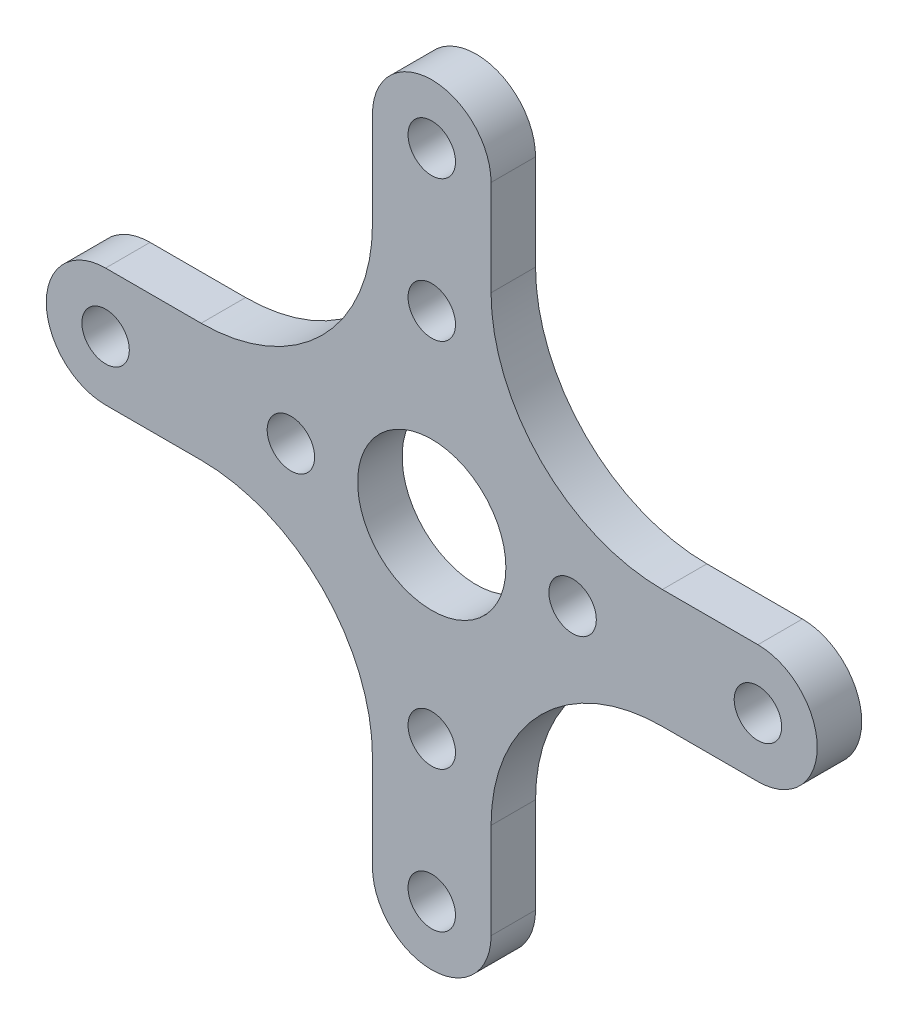
ISO-10303-21;
HEADER;
FILE_DESCRIPTION(('STEP AP214'),'2;1');
FILE_NAME('part.step','',(''),(''),'','','');
FILE_SCHEMA(('AUTOMOTIVE_DESIGN { 1 0 10303 214 1 1 1 1 }'));
ENDSEC;
DATA;
#1=APPLICATION_CONTEXT('core data for automotive mechanical design processes');
#2=APPLICATION_PROTOCOL_DEFINITION('international standard','automotive_design',2000,#1);
#3=PRODUCT_CONTEXT('',#1,'mechanical');
#4=PRODUCT('Part','Part','',(#3));
#5=PRODUCT_RELATED_PRODUCT_CATEGORY('part','',(#4));
#6=PRODUCT_DEFINITION_FORMATION('','',#4);
#7=PRODUCT_DEFINITION_CONTEXT('part definition',#1,'design');
#8=PRODUCT_DEFINITION('design','',#6,#7);
#9=PRODUCT_DEFINITION_SHAPE('','',#8);
#10=(LENGTH_UNIT() NAMED_UNIT(*) SI_UNIT(.MILLI.,.METRE.));
#11=(NAMED_UNIT(*) PLANE_ANGLE_UNIT() SI_UNIT($,.RADIAN.));
#12=(NAMED_UNIT(*) SI_UNIT($,.STERADIAN.) SOLID_ANGLE_UNIT());
#13=UNCERTAINTY_MEASURE_WITH_UNIT(LENGTH_MEASURE(1.E-05),#10,'distance_accuracy_value','');
#14=(GEOMETRIC_REPRESENTATION_CONTEXT(3) GLOBAL_UNCERTAINTY_ASSIGNED_CONTEXT((#13)) GLOBAL_UNIT_ASSIGNED_CONTEXT((#10,
#11,#12)) REPRESENTATION_CONTEXT('',''));
#15=CARTESIAN_POINT('',(0.,0.,0.));
#16=DIRECTION('',(0.,0.,1.));
#17=DIRECTION('',(1.,0.,0.));
#18=AXIS2_PLACEMENT_3D('',#15,#16,#17);
#19=CARTESIAN_POINT('',(-22.,0.,1.5));
#20=DIRECTION('',(0.,0.,1.));
#21=DIRECTION('',(1.,0.,0.));
#22=AXIS2_PLACEMENT_3D('',#19,#20,#21);
#23=PLANE('',#22);
#24=CARTESIAN_POINT('',(0.,12.5,1.5));
#25=DIRECTION('',(0.,0.,1.));
#26=DIRECTION('',(1.,0.,0.));
#27=AXIS2_PLACEMENT_3D('',#24,#25,#26);
#28=CIRCLE('',#27,1.6);
#29=CARTESIAN_POINT('',(1.60000000000001,12.5,1.5));
#30=VERTEX_POINT('',#29);
#31=EDGE_CURVE('E364',#30,#30,#28,.T.);
#32=ORIENTED_EDGE('',*,*,#31,.F.);
#33=EDGE_LOOP('',(#32));
#34=FACE_BOUND('',#33,.T.);
#35=CARTESIAN_POINT('',(-9.5,0.,1.5));
#36=DIRECTION('',(0.,0.,1.));
#37=DIRECTION('',(1.,0.,0.));
#38=AXIS2_PLACEMENT_3D('',#35,#36,#37);
#39=CIRCLE('',#38,1.6);
#40=CARTESIAN_POINT('',(-7.9,0.,1.5));
#41=VERTEX_POINT('',#40);
#42=EDGE_CURVE('E376',#41,#41,#39,.T.);
#43=ORIENTED_EDGE('',*,*,#42,.F.);
#44=EDGE_LOOP('',(#43));
#45=FACE_BOUND('',#44,.T.);
#46=CARTESIAN_POINT('',(-22.,0.,1.5));
#47=DIRECTION('',(0.,0.,1.));
#48=DIRECTION('',(1.,0.,0.));
#49=AXIS2_PLACEMENT_3D('',#46,#47,#48);
#50=CIRCLE('',#49,1.6);
#51=CARTESIAN_POINT('',(-20.4,0.,1.5));
#52=VERTEX_POINT('',#51);
#53=EDGE_CURVE('E388',#52,#52,#50,.T.);
#54=ORIENTED_EDGE('',*,*,#53,.F.);
#55=EDGE_LOOP('',(#54));
#56=FACE_BOUND('',#55,.T.);
#57=CARTESIAN_POINT('',(22.,0.,1.5));
#58=DIRECTION('',(0.,0.,1.));
#59=DIRECTION('',(1.,0.,0.));
#60=AXIS2_PLACEMENT_3D('',#57,#58,#59);
#61=CIRCLE('',#60,1.6);
#62=CARTESIAN_POINT('',(23.6,0.,1.5));
#63=VERTEX_POINT('',#62);
#64=EDGE_CURVE('E400',#63,#63,#61,.T.);
#65=ORIENTED_EDGE('',*,*,#64,.F.);
#66=EDGE_LOOP('',(#65));
#67=FACE_BOUND('',#66,.T.);
#68=CARTESIAN_POINT('',(-22.,0.,1.5));
#69=DIRECTION('',(0.,0.,1.));
#70=DIRECTION('',(1.,0.,0.));
#71=AXIS2_PLACEMENT_3D('',#68,#69,#70);
#72=CIRCLE('',#71,3.99999999999999);
#73=CARTESIAN_POINT('',(-22.,3.99999999999999,1.5));
#74=VERTEX_POINT('',#73);
#75=CARTESIAN_POINT('',(-22.,-3.99999999999999,1.5));
#76=VERTEX_POINT('',#75);
#77=EDGE_CURVE('E210',#74,#76,#72,.T.);
#78=ORIENTED_EDGE('',*,*,#77,.T.);
#79=DIRECTION('',(1.,0.,0.));
#80=VECTOR('',#79,1.);
#81=CARTESIAN_POINT('',(-22.,-3.99999999999999,1.5));
#82=LINE('',#81,#80);
#83=CARTESIAN_POINT('',(-15.5563491861041,-3.99999999999999,1.5));
#84=VERTEX_POINT('',#83);
#85=EDGE_CURVE('E118',#76,#84,#82,.T.);
#86=ORIENTED_EDGE('',*,*,#85,.T.);
#87=CARTESIAN_POINT('',(-15.5563491861041,-15.556349186104,1.5));
#88=DIRECTION('',(0.,0.,-1.));
#89=DIRECTION('',(-1.,0.,0.));
#90=AXIS2_PLACEMENT_3D('',#87,#88,#89);
#91=CIRCLE('',#90,11.5563491861041);
#92=CARTESIAN_POINT('',(-4.,-15.556349186104,1.5));
#93=VERTEX_POINT('',#92);
#94=EDGE_CURVE('E249',#84,#93,#91,.T.);
#95=ORIENTED_EDGE('',*,*,#94,.T.);
#96=DIRECTION('',(0.,-1.,0.));
#97=VECTOR('',#96,1.);
#98=CARTESIAN_POINT('',(-4.,-15.556349186104,1.5));
#99=LINE('',#98,#97);
#100=CARTESIAN_POINT('',(-4.,-22.,1.5));
#101=VERTEX_POINT('',#100);
#102=EDGE_CURVE('E268',#93,#101,#99,.T.);
#103=ORIENTED_EDGE('',*,*,#102,.T.);
#104=CARTESIAN_POINT('',(0.,-22.,1.5));
#105=DIRECTION('',(0.,0.,1.));
#106=DIRECTION('',(1.,0.,0.));
#107=AXIS2_PLACEMENT_3D('',#104,#105,#106);
#108=CIRCLE('',#107,4.);
#109=CARTESIAN_POINT('',(4.,-22.,1.5));
#110=VERTEX_POINT('',#109);
#111=EDGE_CURVE('E265',#101,#110,#108,.T.);
#112=ORIENTED_EDGE('',*,*,#111,.T.);
#113=DIRECTION('',(0.,1.,0.));
#114=VECTOR('',#113,1.);
#115=CARTESIAN_POINT('',(4.,-15.556349186104,1.5));
#116=LINE('',#115,#114);
#117=CARTESIAN_POINT('',(4.,-15.556349186104,1.5));
#118=VERTEX_POINT('',#117);
#119=EDGE_CURVE('E267',#110,#118,#116,.T.);
#120=ORIENTED_EDGE('',*,*,#119,.T.);
#121=CARTESIAN_POINT('',(15.5563491861041,-15.556349186104,1.5));
#122=DIRECTION('',(0.,0.,-1.));
#123=DIRECTION('',(1.,0.,0.));
#124=AXIS2_PLACEMENT_3D('',#121,#122,#123);
#125=CIRCLE('',#124,11.5563491861041);
#126=CARTESIAN_POINT('',(15.5563491861041,-3.99999999999999,1.5));
#127=VERTEX_POINT('',#126);
#128=EDGE_CURVE('E270',#118,#127,#125,.T.);
#129=ORIENTED_EDGE('',*,*,#128,.T.);
#130=DIRECTION('',(1.,0.,0.));
#131=VECTOR('',#130,1.);
#132=CARTESIAN_POINT('',(22.,-3.99999999999999,1.5));
#133=LINE('',#132,#131);
#134=CARTESIAN_POINT('',(22.,-3.99999999999999,1.5));
#135=VERTEX_POINT('',#134);
#136=EDGE_CURVE('E276',#127,#135,#133,.T.);
#137=ORIENTED_EDGE('',*,*,#136,.T.);
#138=CARTESIAN_POINT('',(22.,0.,1.5));
#139=DIRECTION('',(0.,0.,1.));
#140=DIRECTION('',(-1.,0.,0.));
#141=AXIS2_PLACEMENT_3D('',#138,#139,#140);
#142=CIRCLE('',#141,3.99999999999999);
#143=CARTESIAN_POINT('',(22.,3.99999999999999,1.5));
#144=VERTEX_POINT('',#143);
#145=EDGE_CURVE('E278',#135,#144,#142,.T.);
#146=ORIENTED_EDGE('',*,*,#145,.T.);
#147=DIRECTION('',(-1.,0.,0.));
#148=VECTOR('',#147,1.);
#149=CARTESIAN_POINT('',(22.,3.99999999999999,1.5));
#150=LINE('',#149,#148);
#151=CARTESIAN_POINT('',(15.5563491861041,3.99999999999999,1.5));
#152=VERTEX_POINT('',#151);
#153=EDGE_CURVE('E280',#144,#152,#150,.T.);
#154=ORIENTED_EDGE('',*,*,#153,.T.);
#155=CARTESIAN_POINT('',(15.5563491861041,15.556349186104,1.5));
#156=DIRECTION('',(0.,0.,-1.));
#157=DIRECTION('',(-1.,0.,0.));
#158=AXIS2_PLACEMENT_3D('',#155,#156,#157);
#159=CIRCLE('',#158,11.5563491861041);
#160=CARTESIAN_POINT('',(4.,15.556349186104,1.5));
#161=VERTEX_POINT('',#160);
#162=EDGE_CURVE('E282',#152,#161,#159,.T.);
#163=ORIENTED_EDGE('',*,*,#162,.T.);
#164=DIRECTION('',(0.,1.,0.));
#165=VECTOR('',#164,1.);
#166=CARTESIAN_POINT('',(4.,15.556349186104,1.5));
#167=LINE('',#166,#165);
#168=CARTESIAN_POINT('',(4.,22.,1.5));
#169=VERTEX_POINT('',#168);
#170=EDGE_CURVE('E284',#161,#169,#167,.T.);
#171=ORIENTED_EDGE('',*,*,#170,.T.);
#172=CARTESIAN_POINT('',(0.,22.,1.5));
#173=DIRECTION('',(0.,0.,1.));
#174=DIRECTION('',(-1.,0.,0.));
#175=AXIS2_PLACEMENT_3D('',#172,#173,#174);
#176=CIRCLE('',#175,4.);
#177=CARTESIAN_POINT('',(-4.,22.,1.5));
#178=VERTEX_POINT('',#177);
#179=EDGE_CURVE('E161',#169,#178,#176,.T.);
#180=ORIENTED_EDGE('',*,*,#179,.T.);
#181=DIRECTION('',(0.,-1.,0.));
#182=VECTOR('',#181,1.);
#183=CARTESIAN_POINT('',(-4.,15.556349186104,1.5));
#184=LINE('',#183,#182);
#185=CARTESIAN_POINT('',(-4.,15.556349186104,1.5));
#186=VERTEX_POINT('',#185);
#187=EDGE_CURVE('E155',#178,#186,#184,.T.);
#188=ORIENTED_EDGE('',*,*,#187,.T.);
#189=CARTESIAN_POINT('',(-15.5563491861041,15.556349186104,1.5));
#190=DIRECTION('',(0.,0.,-1.));
#191=DIRECTION('',(1.,0.,0.));
#192=AXIS2_PLACEMENT_3D('',#189,#190,#191);
#193=CIRCLE('',#192,11.5563491861041);
#194=CARTESIAN_POINT('',(-15.5563491861041,3.99999999999999,1.5));
#195=VERTEX_POINT('',#194);
#196=EDGE_CURVE('E159',#186,#195,#193,.T.);
#197=ORIENTED_EDGE('',*,*,#196,.T.);
#198=DIRECTION('',(-1.,0.,0.));
#199=VECTOR('',#198,1.);
#200=CARTESIAN_POINT('',(-22.,3.99999999999999,1.5));
#201=LINE('',#200,#199);
#202=EDGE_CURVE('E51',#195,#74,#201,.T.);
#203=ORIENTED_EDGE('',*,*,#202,.T.);
#204=EDGE_LOOP('',(#78,#86,#95,#103,#112,#120,#129,#137,#146,#154,#163,#171,#180,#188,#197,#203));
#205=FACE_BOUND('',#204,.T.);
#206=CARTESIAN_POINT('',(0.,22.,1.5));
#207=DIRECTION('',(0.,0.,1.));
#208=DIRECTION('',(1.,0.,0.));
#209=AXIS2_PLACEMENT_3D('',#206,#207,#208);
#210=CIRCLE('',#209,1.6);
#211=CARTESIAN_POINT('',(1.6,22.,1.5));
#212=VERTEX_POINT('',#211);
#213=EDGE_CURVE('E183',#212,#212,#210,.T.);
#214=ORIENTED_EDGE('',*,*,#213,.F.);
#215=EDGE_LOOP('',(#214));
#216=FACE_BOUND('',#215,.T.);
#217=CARTESIAN_POINT('',(0.,-22.,1.5));
#218=DIRECTION('',(0.,0.,1.));
#219=DIRECTION('',(1.,0.,0.));
#220=AXIS2_PLACEMENT_3D('',#217,#218,#219);
#221=CIRCLE('',#220,1.6);
#222=CARTESIAN_POINT('',(1.6,-22.,1.5));
#223=VERTEX_POINT('',#222);
#224=EDGE_CURVE('E394',#223,#223,#221,.T.);
#225=ORIENTED_EDGE('',*,*,#224,.F.);
#226=EDGE_LOOP('',(#225));
#227=FACE_BOUND('',#226,.T.);
#228=CARTESIAN_POINT('',(0.,0.,1.5));
#229=DIRECTION('',(0.,0.,1.));
#230=DIRECTION('',(1.,0.,0.));
#231=AXIS2_PLACEMENT_3D('',#228,#229,#230);
#232=CIRCLE('',#231,5.);
#233=CARTESIAN_POINT('',(5.,0.,1.5));
#234=VERTEX_POINT('',#233);
#235=EDGE_CURVE('E382',#234,#234,#232,.T.);
#236=ORIENTED_EDGE('',*,*,#235,.F.);
#237=EDGE_LOOP('',(#236));
#238=FACE_BOUND('',#237,.T.);
#239=CARTESIAN_POINT('',(9.5,0.,1.5));
#240=DIRECTION('',(0.,0.,1.));
#241=DIRECTION('',(1.,0.,0.));
#242=AXIS2_PLACEMENT_3D('',#239,#240,#241);
#243=CIRCLE('',#242,1.6);
#244=CARTESIAN_POINT('',(11.1,0.,1.5));
#245=VERTEX_POINT('',#244);
#246=EDGE_CURVE('E370',#245,#245,#243,.T.);
#247=ORIENTED_EDGE('',*,*,#246,.F.);
#248=EDGE_LOOP('',(#247));
#249=FACE_BOUND('',#248,.T.);
#250=CARTESIAN_POINT('',(0.,-12.5,1.5));
#251=DIRECTION('',(0.,0.,1.));
#252=DIRECTION('',(1.,0.,0.));
#253=AXIS2_PLACEMENT_3D('',#250,#251,#252);
#254=CIRCLE('',#253,1.6);
#255=CARTESIAN_POINT('',(1.60000000000001,-12.5,1.5));
#256=VERTEX_POINT('',#255);
#257=EDGE_CURVE('E355',#256,#256,#254,.T.);
#258=ORIENTED_EDGE('',*,*,#257,.F.);
#259=EDGE_LOOP('',(#258));
#260=FACE_BOUND('',#259,.T.);
#261=ADVANCED_FACE('F34',(#34,#45,#56,#67,#205,#216,#227,#238,#249,#260),#23,.T.);
#262=CARTESIAN_POINT('',(-22.,0.,-1.5));
#263=DIRECTION('',(0.,0.,1.));
#264=DIRECTION('',(1.,0.,0.));
#265=AXIS2_PLACEMENT_3D('',#262,#263,#264);
#266=PLANE('',#265);
#267=CARTESIAN_POINT('',(-22.,0.,-1.5));
#268=DIRECTION('',(0.,0.,1.));
#269=DIRECTION('',(1.,0.,0.));
#270=AXIS2_PLACEMENT_3D('',#267,#268,#269);
#271=CIRCLE('',#270,3.99999999999999);
#272=CARTESIAN_POINT('',(-22.,3.99999999999999,-1.5));
#273=VERTEX_POINT('',#272);
#274=CARTESIAN_POINT('',(-22.,-3.99999999999999,-1.5));
#275=VERTEX_POINT('',#274);
#276=EDGE_CURVE('E179',#273,#275,#271,.T.);
#277=ORIENTED_EDGE('',*,*,#276,.F.);
#278=DIRECTION('',(-1.,0.,0.));
#279=VECTOR('',#278,1.);
#280=CARTESIAN_POINT('',(-22.,3.99999999999999,-1.5));
#281=LINE('',#280,#279);
#282=CARTESIAN_POINT('',(-15.5563491861041,3.99999999999999,-1.5));
#283=VERTEX_POINT('',#282);
#284=EDGE_CURVE('E110',#283,#273,#281,.T.);
#285=ORIENTED_EDGE('',*,*,#284,.F.);
#286=CARTESIAN_POINT('',(-15.5563491861041,15.556349186104,-1.5));
#287=DIRECTION('',(0.,0.,-1.));
#288=DIRECTION('',(1.,0.,0.));
#289=AXIS2_PLACEMENT_3D('',#286,#287,#288);
#290=CIRCLE('',#289,11.5563491861041);
#291=CARTESIAN_POINT('',(-4.,15.556349186104,-1.5));
#292=VERTEX_POINT('',#291);
#293=EDGE_CURVE('E104',#292,#283,#290,.T.);
#294=ORIENTED_EDGE('',*,*,#293,.F.);
#295=DIRECTION('',(0.,-1.,0.));
#296=VECTOR('',#295,1.);
#297=CARTESIAN_POINT('',(-4.,15.556349186104,-1.5));
#298=LINE('',#297,#296);
#299=CARTESIAN_POINT('',(-4.,22.,-1.5));
#300=VERTEX_POINT('',#299);
#301=EDGE_CURVE('E169',#300,#292,#298,.T.);
#302=ORIENTED_EDGE('',*,*,#301,.F.);
#303=CARTESIAN_POINT('',(0.,22.,-1.5));
#304=DIRECTION('',(0.,0.,1.));
#305=DIRECTION('',(-1.,0.,0.));
#306=AXIS2_PLACEMENT_3D('',#303,#304,#305);
#307=CIRCLE('',#306,4.);
#308=CARTESIAN_POINT('',(4.,22.,-1.5));
#309=VERTEX_POINT('',#308);
#310=EDGE_CURVE('E205',#309,#300,#307,.T.);
#311=ORIENTED_EDGE('',*,*,#310,.F.);
#312=DIRECTION('',(0.,1.,0.));
#313=VECTOR('',#312,1.);
#314=CARTESIAN_POINT('',(4.,15.556349186104,-1.5));
#315=LINE('',#314,#313);
#316=CARTESIAN_POINT('',(4.,15.556349186104,-1.5));
#317=VERTEX_POINT('',#316);
#318=EDGE_CURVE('E203',#317,#309,#315,.T.);
#319=ORIENTED_EDGE('',*,*,#318,.F.);
#320=CARTESIAN_POINT('',(15.5563491861041,15.556349186104,-1.5));
#321=DIRECTION('',(0.,0.,-1.));
#322=DIRECTION('',(-1.,0.,0.));
#323=AXIS2_PLACEMENT_3D('',#320,#321,#322);
#324=CIRCLE('',#323,11.5563491861041);
#325=CARTESIAN_POINT('',(15.5563491861041,3.99999999999999,-1.5));
#326=VERTEX_POINT('',#325);
#327=EDGE_CURVE('E201',#326,#317,#324,.T.);
#328=ORIENTED_EDGE('',*,*,#327,.F.);
#329=DIRECTION('',(-1.,0.,0.));
#330=VECTOR('',#329,1.);
#331=CARTESIAN_POINT('',(22.,3.99999999999999,-1.5));
#332=LINE('',#331,#330);
#333=CARTESIAN_POINT('',(22.,3.99999999999999,-1.5));
#334=VERTEX_POINT('',#333);
#335=EDGE_CURVE('E199',#334,#326,#332,.T.);
#336=ORIENTED_EDGE('',*,*,#335,.F.);
#337=CARTESIAN_POINT('',(22.,0.,-1.5));
#338=DIRECTION('',(0.,0.,1.));
#339=DIRECTION('',(-1.,0.,0.));
#340=AXIS2_PLACEMENT_3D('',#337,#338,#339);
#341=CIRCLE('',#340,3.99999999999999);
#342=CARTESIAN_POINT('',(22.,-3.99999999999999,-1.5));
#343=VERTEX_POINT('',#342);
#344=EDGE_CURVE('E197',#343,#334,#341,.T.);
#345=ORIENTED_EDGE('',*,*,#344,.F.);
#346=DIRECTION('',(1.,0.,0.));
#347=VECTOR('',#346,1.);
#348=CARTESIAN_POINT('',(22.,-3.99999999999999,-1.5));
#349=LINE('',#348,#347);
#350=CARTESIAN_POINT('',(15.5563491861041,-3.99999999999999,-1.5));
#351=VERTEX_POINT('',#350);
#352=EDGE_CURVE('E195',#351,#343,#349,.T.);
#353=ORIENTED_EDGE('',*,*,#352,.F.);
#354=CARTESIAN_POINT('',(15.5563491861041,-15.556349186104,-1.5));
#355=DIRECTION('',(0.,0.,-1.));
#356=DIRECTION('',(1.,0.,0.));
#357=AXIS2_PLACEMENT_3D('',#354,#355,#356);
#358=CIRCLE('',#357,11.5563491861041);
#359=CARTESIAN_POINT('',(4.,-15.556349186104,-1.5));
#360=VERTEX_POINT('',#359);
#361=EDGE_CURVE('E193',#360,#351,#358,.T.);
#362=ORIENTED_EDGE('',*,*,#361,.F.);
#363=DIRECTION('',(0.,1.,0.));
#364=VECTOR('',#363,1.);
#365=CARTESIAN_POINT('',(4.,-15.556349186104,-1.5));
#366=LINE('',#365,#364);
#367=CARTESIAN_POINT('',(4.,-22.,-1.5));
#368=VERTEX_POINT('',#367);
#369=EDGE_CURVE('E191',#368,#360,#366,.T.);
#370=ORIENTED_EDGE('',*,*,#369,.F.);
#371=CARTESIAN_POINT('',(0.,-22.,-1.5));
#372=DIRECTION('',(0.,0.,1.));
#373=DIRECTION('',(1.,0.,0.));
#374=AXIS2_PLACEMENT_3D('',#371,#372,#373);
#375=CIRCLE('',#374,4.);
#376=CARTESIAN_POINT('',(-4.,-22.,-1.5));
#377=VERTEX_POINT('',#376);
#378=EDGE_CURVE('E189',#377,#368,#375,.T.);
#379=ORIENTED_EDGE('',*,*,#378,.F.);
#380=DIRECTION('',(0.,-1.,0.));
#381=VECTOR('',#380,1.);
#382=CARTESIAN_POINT('',(-4.,-15.556349186104,-1.5));
#383=LINE('',#382,#381);
#384=CARTESIAN_POINT('',(-4.,-15.556349186104,-1.5));
#385=VERTEX_POINT('',#384);
#386=EDGE_CURVE('E187',#385,#377,#383,.T.);
#387=ORIENTED_EDGE('',*,*,#386,.F.);
#388=CARTESIAN_POINT('',(-15.5563491861041,-15.556349186104,-1.5));
#389=DIRECTION('',(0.,0.,-1.));
#390=DIRECTION('',(-1.,0.,0.));
#391=AXIS2_PLACEMENT_3D('',#388,#389,#390);
#392=CIRCLE('',#391,11.5563491861041);
#393=CARTESIAN_POINT('',(-15.5563491861041,-3.99999999999999,-1.5));
#394=VERTEX_POINT('',#393);
#395=EDGE_CURVE('E185',#394,#385,#392,.T.);
#396=ORIENTED_EDGE('',*,*,#395,.F.);
#397=DIRECTION('',(1.,0.,0.));
#398=VECTOR('',#397,1.);
#399=CARTESIAN_POINT('',(-22.,-3.99999999999999,-1.5));
#400=LINE('',#399,#398);
#401=EDGE_CURVE('E182',#275,#394,#400,.T.);
#402=ORIENTED_EDGE('',*,*,#401,.F.);
#403=EDGE_LOOP('',(#277,#285,#294,#302,#311,#319,#328,#336,#345,#353,#362,#370,#379,#387,#396,#402));
#404=FACE_BOUND('',#403,.T.);
#405=CARTESIAN_POINT('',(0.,22.,-1.5));
#406=DIRECTION('',(0.,0.,1.));
#407=DIRECTION('',(1.,0.,0.));
#408=AXIS2_PLACEMENT_3D('',#405,#406,#407);
#409=CIRCLE('',#408,1.6);
#410=CARTESIAN_POINT('',(1.6,22.,-1.5));
#411=VERTEX_POINT('',#410);
#412=EDGE_CURVE('E403',#411,#411,#409,.T.);
#413=ORIENTED_EDGE('',*,*,#412,.T.);
#414=EDGE_LOOP('',(#413));
#415=FACE_BOUND('',#414,.T.);
#416=CARTESIAN_POINT('',(22.,0.,-1.5));
#417=DIRECTION('',(0.,0.,1.));
#418=DIRECTION('',(1.,0.,0.));
#419=AXIS2_PLACEMENT_3D('',#416,#417,#418);
#420=CIRCLE('',#419,1.6);
#421=CARTESIAN_POINT('',(23.6,0.,-1.5));
#422=VERTEX_POINT('',#421);
#423=EDGE_CURVE('E397',#422,#422,#420,.T.);
#424=ORIENTED_EDGE('',*,*,#423,.T.);
#425=EDGE_LOOP('',(#424));
#426=FACE_BOUND('',#425,.T.);
#427=CARTESIAN_POINT('',(0.,-22.,-1.5));
#428=DIRECTION('',(0.,0.,1.));
#429=DIRECTION('',(1.,0.,0.));
#430=AXIS2_PLACEMENT_3D('',#427,#428,#429);
#431=CIRCLE('',#430,1.6);
#432=CARTESIAN_POINT('',(1.6,-22.,-1.5));
#433=VERTEX_POINT('',#432);
#434=EDGE_CURVE('E391',#433,#433,#431,.T.);
#435=ORIENTED_EDGE('',*,*,#434,.T.);
#436=EDGE_LOOP('',(#435));
#437=FACE_BOUND('',#436,.T.);
#438=CARTESIAN_POINT('',(-22.,0.,-1.5));
#439=DIRECTION('',(0.,0.,1.));
#440=DIRECTION('',(1.,0.,0.));
#441=AXIS2_PLACEMENT_3D('',#438,#439,#440);
#442=CIRCLE('',#441,1.6);
#443=CARTESIAN_POINT('',(-20.4,0.,-1.5));
#444=VERTEX_POINT('',#443);
#445=EDGE_CURVE('E385',#444,#444,#442,.T.);
#446=ORIENTED_EDGE('',*,*,#445,.T.);
#447=EDGE_LOOP('',(#446));
#448=FACE_BOUND('',#447,.T.);
#449=CARTESIAN_POINT('',(0.,0.,-1.5));
#450=DIRECTION('',(0.,0.,1.));
#451=DIRECTION('',(1.,0.,0.));
#452=AXIS2_PLACEMENT_3D('',#449,#450,#451);
#453=CIRCLE('',#452,5.);
#454=CARTESIAN_POINT('',(5.,0.,-1.5));
#455=VERTEX_POINT('',#454);
#456=EDGE_CURVE('E379',#455,#455,#453,.T.);
#457=ORIENTED_EDGE('',*,*,#456,.T.);
#458=EDGE_LOOP('',(#457));
#459=FACE_BOUND('',#458,.T.);
#460=CARTESIAN_POINT('',(-9.5,0.,-1.5));
#461=DIRECTION('',(0.,0.,1.));
#462=DIRECTION('',(1.,0.,0.));
#463=AXIS2_PLACEMENT_3D('',#460,#461,#462);
#464=CIRCLE('',#463,1.6);
#465=CARTESIAN_POINT('',(-7.9,0.,-1.5));
#466=VERTEX_POINT('',#465);
#467=EDGE_CURVE('E373',#466,#466,#464,.T.);
#468=ORIENTED_EDGE('',*,*,#467,.T.);
#469=EDGE_LOOP('',(#468));
#470=FACE_BOUND('',#469,.T.);
#471=CARTESIAN_POINT('',(9.5,0.,-1.5));
#472=DIRECTION('',(0.,0.,1.));
#473=DIRECTION('',(1.,0.,0.));
#474=AXIS2_PLACEMENT_3D('',#471,#472,#473);
#475=CIRCLE('',#474,1.6);
#476=CARTESIAN_POINT('',(11.1,0.,-1.5));
#477=VERTEX_POINT('',#476);
#478=EDGE_CURVE('E367',#477,#477,#475,.T.);
#479=ORIENTED_EDGE('',*,*,#478,.T.);
#480=EDGE_LOOP('',(#479));
#481=FACE_BOUND('',#480,.T.);
#482=CARTESIAN_POINT('',(0.,12.5,-1.5));
#483=DIRECTION('',(0.,0.,1.));
#484=DIRECTION('',(1.,0.,0.));
#485=AXIS2_PLACEMENT_3D('',#482,#483,#484);
#486=CIRCLE('',#485,1.6);
#487=CARTESIAN_POINT('',(1.60000000000001,12.5,-1.5));
#488=VERTEX_POINT('',#487);
#489=EDGE_CURVE('E361',#488,#488,#486,.T.);
#490=ORIENTED_EDGE('',*,*,#489,.T.);
#491=EDGE_LOOP('',(#490));
#492=FACE_BOUND('',#491,.T.);
#493=CARTESIAN_POINT('',(0.,-12.5,-1.5));
#494=DIRECTION('',(0.,0.,1.));
#495=DIRECTION('',(1.,0.,0.));
#496=AXIS2_PLACEMENT_3D('',#493,#494,#495);
#497=CIRCLE('',#496,1.6);
#498=CARTESIAN_POINT('',(1.60000000000001,-12.5,-1.5));
#499=VERTEX_POINT('',#498);
#500=EDGE_CURVE('E358',#499,#499,#497,.T.);
#501=ORIENTED_EDGE('',*,*,#500,.T.);
#502=EDGE_LOOP('',(#501));
#503=FACE_BOUND('',#502,.T.);
#504=ADVANCED_FACE('F253',(#404,#415,#426,#437,#448,#459,#470,#481,#492,#503),#266,.F.);
#505=CARTESIAN_POINT('',(-22.,0.,1.5));
#506=DIRECTION('',(0.,0.,-1.));
#507=DIRECTION('',(-1.,0.,0.));
#508=AXIS2_PLACEMENT_3D('',#505,#506,#507);
#509=CYLINDRICAL_SURFACE('',#508,3.99999999999999);
#510=ORIENTED_EDGE('',*,*,#276,.T.);
#511=DIRECTION('',(0.,0.,-1.));
#512=VECTOR('',#511,1.);
#513=CARTESIAN_POINT('',(-22.,-3.99999999999999,1.5));
#514=LINE('',#513,#512);
#515=EDGE_CURVE('E11',#76,#275,#514,.T.);
#516=ORIENTED_EDGE('',*,*,#515,.F.);
#517=ORIENTED_EDGE('',*,*,#77,.F.);
#518=DIRECTION('',(0.,0.,-1.));
#519=VECTOR('',#518,1.);
#520=CARTESIAN_POINT('',(-22.,3.99999999999999,1.5));
#521=LINE('',#520,#519);
#522=EDGE_CURVE('E175',#74,#273,#521,.T.);
#523=ORIENTED_EDGE('',*,*,#522,.T.);
#524=EDGE_LOOP('',(#510,#516,#517,#523));
#525=FACE_BOUND('',#524,.T.);
#526=ADVANCED_FACE('F36',(#525),#509,.T.);
#527=CARTESIAN_POINT('',(-22.,-3.99999999999999,1.5));
#528=DIRECTION('',(0.,1.,0.));
#529=DIRECTION('',(0.,0.,1.));
#530=AXIS2_PLACEMENT_3D('',#527,#528,#529);
#531=PLANE('',#530);
#532=ORIENTED_EDGE('',*,*,#401,.T.);
#533=DIRECTION('',(0.,0.,-1.));
#534=VECTOR('',#533,1.);
#535=CARTESIAN_POINT('',(-15.5563491861041,-3.99999999999999,1.5));
#536=LINE('',#535,#534);
#537=EDGE_CURVE('E43',#84,#394,#536,.T.);
#538=ORIENTED_EDGE('',*,*,#537,.F.);
#539=ORIENTED_EDGE('',*,*,#85,.F.);
#540=ORIENTED_EDGE('',*,*,#515,.T.);
#541=EDGE_LOOP('',(#532,#538,#539,#540));
#542=FACE_BOUND('',#541,.T.);
#543=ADVANCED_FACE('F598',(#542),#531,.F.);
#544=CARTESIAN_POINT('',(-15.5563491861041,-15.556349186104,1.5));
#545=DIRECTION('',(0.,0.,-1.));
#546=DIRECTION('',(-1.,0.,0.));
#547=AXIS2_PLACEMENT_3D('',#544,#545,#546);
#548=CYLINDRICAL_SURFACE('',#547,11.5563491861041);
#549=ORIENTED_EDGE('',*,*,#395,.T.);
#550=DIRECTION('',(0.,0.,-1.));
#551=VECTOR('',#550,1.);
#552=CARTESIAN_POINT('',(-4.,-15.556349186104,1.5));
#553=LINE('',#552,#551);
#554=EDGE_CURVE('E241',#93,#385,#553,.T.);
#555=ORIENTED_EDGE('',*,*,#554,.F.);
#556=ORIENTED_EDGE('',*,*,#94,.F.);
#557=ORIENTED_EDGE('',*,*,#537,.T.);
#558=EDGE_LOOP('',(#549,#555,#556,#557));
#559=FACE_BOUND('',#558,.T.);
#560=ADVANCED_FACE('F247',(#559),#548,.F.);
#561=CARTESIAN_POINT('',(-4.,-15.556349186104,1.5));
#562=DIRECTION('',(1.,0.,0.));
#563=DIRECTION('',(0.,1.,0.));
#564=AXIS2_PLACEMENT_3D('',#561,#562,#563);
#565=PLANE('',#564);
#566=ORIENTED_EDGE('',*,*,#386,.T.);
#567=DIRECTION('',(0.,0.,-1.));
#568=VECTOR('',#567,1.);
#569=CARTESIAN_POINT('',(-4.,-22.,1.5));
#570=LINE('',#569,#568);
#571=EDGE_CURVE('E238',#101,#377,#570,.T.);
#572=ORIENTED_EDGE('',*,*,#571,.F.);
#573=ORIENTED_EDGE('',*,*,#102,.F.);
#574=ORIENTED_EDGE('',*,*,#554,.T.);
#575=EDGE_LOOP('',(#566,#572,#573,#574));
#576=FACE_BOUND('',#575,.T.);
#577=ADVANCED_FACE('F259',(#576),#565,.F.);
#578=CARTESIAN_POINT('',(0.,-22.,1.5));
#579=DIRECTION('',(0.,0.,-1.));
#580=DIRECTION('',(-1.,0.,0.));
#581=AXIS2_PLACEMENT_3D('',#578,#579,#580);
#582=CYLINDRICAL_SURFACE('',#581,4.);
#583=ORIENTED_EDGE('',*,*,#378,.T.);
#584=DIRECTION('',(0.,0.,-1.));
#585=VECTOR('',#584,1.);
#586=CARTESIAN_POINT('',(4.,-22.,1.5));
#587=LINE('',#586,#585);
#588=EDGE_CURVE('E235',#110,#368,#587,.T.);
#589=ORIENTED_EDGE('',*,*,#588,.F.);
#590=ORIENTED_EDGE('',*,*,#111,.F.);
#591=ORIENTED_EDGE('',*,*,#571,.T.);
#592=EDGE_LOOP('',(#583,#589,#590,#591));
#593=FACE_BOUND('',#592,.T.);
#594=ADVANCED_FACE('F263',(#593),#582,.T.);
#595=CARTESIAN_POINT('',(4.,-15.556349186104,1.5));
#596=DIRECTION('',(-1.,0.,0.));
#597=DIRECTION('',(0.,-1.,0.));
#598=AXIS2_PLACEMENT_3D('',#595,#596,#597);
#599=PLANE('',#598);
#600=ORIENTED_EDGE('',*,*,#369,.T.);
#601=DIRECTION('',(0.,0.,-1.));
#602=VECTOR('',#601,1.);
#603=CARTESIAN_POINT('',(4.,-15.556349186104,1.5));
#604=LINE('',#603,#602);
#605=EDGE_CURVE('E232',#118,#360,#604,.T.);
#606=ORIENTED_EDGE('',*,*,#605,.F.);
#607=ORIENTED_EDGE('',*,*,#119,.F.);
#608=ORIENTED_EDGE('',*,*,#588,.T.);
#609=EDGE_LOOP('',(#600,#606,#607,#608));
#610=FACE_BOUND('',#609,.T.);
#611=ADVANCED_FACE('F563',(#610),#599,.F.);
#612=CARTESIAN_POINT('',(15.5563491861041,-15.556349186104,1.5));
#613=DIRECTION('',(0.,0.,-1.));
#614=DIRECTION('',(-1.,0.,0.));
#615=AXIS2_PLACEMENT_3D('',#612,#613,#614);
#616=CYLINDRICAL_SURFACE('',#615,11.5563491861041);
#617=ORIENTED_EDGE('',*,*,#361,.T.);
#618=DIRECTION('',(0.,0.,-1.));
#619=VECTOR('',#618,1.);
#620=CARTESIAN_POINT('',(15.5563491861041,-3.99999999999999,1.5));
#621=LINE('',#620,#619);
#622=EDGE_CURVE('E229',#127,#351,#621,.T.);
#623=ORIENTED_EDGE('',*,*,#622,.F.);
#624=ORIENTED_EDGE('',*,*,#128,.F.);
#625=ORIENTED_EDGE('',*,*,#605,.T.);
#626=EDGE_LOOP('',(#617,#623,#624,#625));
#627=FACE_BOUND('',#626,.T.);
#628=ADVANCED_FACE('F553',(#627),#616,.F.);
#629=CARTESIAN_POINT('',(22.,-3.99999999999999,1.5));
#630=DIRECTION('',(0.,1.,0.));
#631=DIRECTION('',(0.,0.,1.));
#632=AXIS2_PLACEMENT_3D('',#629,#630,#631);
#633=PLANE('',#632);
#634=ORIENTED_EDGE('',*,*,#352,.T.);
#635=DIRECTION('',(0.,0.,-1.));
#636=VECTOR('',#635,1.);
#637=CARTESIAN_POINT('',(22.,-3.99999999999999,1.5));
#638=LINE('',#637,#636);
#639=EDGE_CURVE('E226',#135,#343,#638,.T.);
#640=ORIENTED_EDGE('',*,*,#639,.F.);
#641=ORIENTED_EDGE('',*,*,#136,.F.);
#642=ORIENTED_EDGE('',*,*,#622,.T.);
#643=EDGE_LOOP('',(#634,#640,#641,#642));
#644=FACE_BOUND('',#643,.T.);
#645=ADVANCED_FACE('F543',(#644),#633,.F.);
#646=CARTESIAN_POINT('',(22.,0.,1.5));
#647=DIRECTION('',(0.,0.,-1.));
#648=DIRECTION('',(-1.,0.,0.));
#649=AXIS2_PLACEMENT_3D('',#646,#647,#648);
#650=CYLINDRICAL_SURFACE('',#649,3.99999999999999);
#651=ORIENTED_EDGE('',*,*,#344,.T.);
#652=DIRECTION('',(0.,0.,-1.));
#653=VECTOR('',#652,1.);
#654=CARTESIAN_POINT('',(22.,3.99999999999999,1.5));
#655=LINE('',#654,#653);
#656=EDGE_CURVE('E223',#144,#334,#655,.T.);
#657=ORIENTED_EDGE('',*,*,#656,.F.);
#658=ORIENTED_EDGE('',*,*,#145,.F.);
#659=ORIENTED_EDGE('',*,*,#639,.T.);
#660=EDGE_LOOP('',(#651,#657,#658,#659));
#661=FACE_BOUND('',#660,.T.);
#662=ADVANCED_FACE('F533',(#661),#650,.T.);
#663=CARTESIAN_POINT('',(22.,3.99999999999999,1.5));
#664=DIRECTION('',(0.,-1.,0.));
#665=DIRECTION('',(0.,0.,-1.));
#666=AXIS2_PLACEMENT_3D('',#663,#664,#665);
#667=PLANE('',#666);
#668=ORIENTED_EDGE('',*,*,#335,.T.);
#669=DIRECTION('',(0.,0.,-1.));
#670=VECTOR('',#669,1.);
#671=CARTESIAN_POINT('',(15.5563491861041,3.99999999999999,1.5));
#672=LINE('',#671,#670);
#673=EDGE_CURVE('E220',#152,#326,#672,.T.);
#674=ORIENTED_EDGE('',*,*,#673,.F.);
#675=ORIENTED_EDGE('',*,*,#153,.F.);
#676=ORIENTED_EDGE('',*,*,#656,.T.);
#677=EDGE_LOOP('',(#668,#674,#675,#676));
#678=FACE_BOUND('',#677,.T.);
#679=ADVANCED_FACE('F523',(#678),#667,.F.);
#680=CARTESIAN_POINT('',(15.5563491861041,15.556349186104,1.5));
#681=DIRECTION('',(0.,0.,-1.));
#682=DIRECTION('',(-1.,0.,0.));
#683=AXIS2_PLACEMENT_3D('',#680,#681,#682);
#684=CYLINDRICAL_SURFACE('',#683,11.5563491861041);
#685=ORIENTED_EDGE('',*,*,#327,.T.);
#686=DIRECTION('',(0.,0.,-1.));
#687=VECTOR('',#686,1.);
#688=CARTESIAN_POINT('',(4.,15.556349186104,1.5));
#689=LINE('',#688,#687);
#690=EDGE_CURVE('E217',#161,#317,#689,.T.);
#691=ORIENTED_EDGE('',*,*,#690,.F.);
#692=ORIENTED_EDGE('',*,*,#162,.F.);
#693=ORIENTED_EDGE('',*,*,#673,.T.);
#694=EDGE_LOOP('',(#685,#691,#692,#693));
#695=FACE_BOUND('',#694,.T.);
#696=ADVANCED_FACE('F514',(#695),#684,.F.);
#697=CARTESIAN_POINT('',(4.,15.556349186104,1.5));
#698=DIRECTION('',(-1.,0.,0.));
#699=DIRECTION('',(0.,-1.,0.));
#700=AXIS2_PLACEMENT_3D('',#697,#698,#699);
#701=PLANE('',#700);
#702=ORIENTED_EDGE('',*,*,#318,.T.);
#703=DIRECTION('',(0.,0.,-1.));
#704=VECTOR('',#703,1.);
#705=CARTESIAN_POINT('',(4.,22.,1.5));
#706=LINE('',#705,#704);
#707=EDGE_CURVE('E214',#169,#309,#706,.T.);
#708=ORIENTED_EDGE('',*,*,#707,.F.);
#709=ORIENTED_EDGE('',*,*,#170,.F.);
#710=ORIENTED_EDGE('',*,*,#690,.T.);
#711=EDGE_LOOP('',(#702,#708,#709,#710));
#712=FACE_BOUND('',#711,.T.);
#713=ADVANCED_FACE('F290',(#712),#701,.F.);
#714=CARTESIAN_POINT('',(0.,22.,1.5));
#715=DIRECTION('',(0.,0.,-1.));
#716=DIRECTION('',(-1.,0.,0.));
#717=AXIS2_PLACEMENT_3D('',#714,#715,#716);
#718=CYLINDRICAL_SURFACE('',#717,4.);
#719=ORIENTED_EDGE('',*,*,#310,.T.);
#720=DIRECTION('',(0.,0.,-1.));
#721=VECTOR('',#720,1.);
#722=CARTESIAN_POINT('',(-4.,22.,1.5));
#723=LINE('',#722,#721);
#724=EDGE_CURVE('E170',#178,#300,#723,.T.);
#725=ORIENTED_EDGE('',*,*,#724,.F.);
#726=ORIENTED_EDGE('',*,*,#179,.F.);
#727=ORIENTED_EDGE('',*,*,#707,.T.);
#728=EDGE_LOOP('',(#719,#725,#726,#727));
#729=FACE_BOUND('',#728,.T.);
#730=ADVANCED_FACE('F294',(#729),#718,.T.);
#731=CARTESIAN_POINT('',(-4.,15.556349186104,1.5));
#732=DIRECTION('',(1.,0.,0.));
#733=DIRECTION('',(0.,1.,0.));
#734=AXIS2_PLACEMENT_3D('',#731,#732,#733);
#735=PLANE('',#734);
#736=ORIENTED_EDGE('',*,*,#301,.T.);
#737=DIRECTION('',(0.,0.,-1.));
#738=VECTOR('',#737,1.);
#739=CARTESIAN_POINT('',(-4.,15.556349186104,1.5));
#740=LINE('',#739,#738);
#741=EDGE_CURVE('E166',#186,#292,#740,.T.);
#742=ORIENTED_EDGE('',*,*,#741,.F.);
#743=ORIENTED_EDGE('',*,*,#187,.F.);
#744=ORIENTED_EDGE('',*,*,#724,.T.);
#745=EDGE_LOOP('',(#736,#742,#743,#744));
#746=FACE_BOUND('',#745,.T.);
#747=ADVANCED_FACE('F167',(#746),#735,.F.);
#748=CARTESIAN_POINT('',(-15.5563491861041,15.556349186104,1.5));
#749=DIRECTION('',(0.,0.,-1.));
#750=DIRECTION('',(-1.,0.,0.));
#751=AXIS2_PLACEMENT_3D('',#748,#749,#750);
#752=CYLINDRICAL_SURFACE('',#751,11.5563491861041);
#753=ORIENTED_EDGE('',*,*,#293,.T.);
#754=DIRECTION('',(0.,0.,-1.));
#755=VECTOR('',#754,1.);
#756=CARTESIAN_POINT('',(-15.5563491861041,3.99999999999999,1.5));
#757=LINE('',#756,#755);
#758=EDGE_CURVE('E171',#195,#283,#757,.T.);
#759=ORIENTED_EDGE('',*,*,#758,.F.);
#760=ORIENTED_EDGE('',*,*,#196,.F.);
#761=ORIENTED_EDGE('',*,*,#741,.T.);
#762=EDGE_LOOP('',(#753,#759,#760,#761));
#763=FACE_BOUND('',#762,.T.);
#764=ADVANCED_FACE('F173',(#763),#752,.F.);
#765=CARTESIAN_POINT('',(-22.,3.99999999999999,1.5));
#766=DIRECTION('',(0.,-1.,0.));
#767=DIRECTION('',(0.,0.,-1.));
#768=AXIS2_PLACEMENT_3D('',#765,#766,#767);
#769=PLANE('',#768);
#770=ORIENTED_EDGE('',*,*,#284,.T.);
#771=ORIENTED_EDGE('',*,*,#522,.F.);
#772=ORIENTED_EDGE('',*,*,#202,.F.);
#773=ORIENTED_EDGE('',*,*,#758,.T.);
#774=EDGE_LOOP('',(#770,#771,#772,#773));
#775=FACE_BOUND('',#774,.T.);
#776=ADVANCED_FACE('F298',(#775),#769,.F.);
#777=CARTESIAN_POINT('',(0.,22.,1.5));
#778=DIRECTION('',(0.,0.,-1.));
#779=DIRECTION('',(-1.,0.,0.));
#780=AXIS2_PLACEMENT_3D('',#777,#778,#779);
#781=CYLINDRICAL_SURFACE('',#780,1.6);
#782=ORIENTED_EDGE('',*,*,#213,.T.);
#783=EDGE_LOOP('',(#782));
#784=FACE_BOUND('',#783,.T.);
#785=ORIENTED_EDGE('',*,*,#412,.F.);
#786=EDGE_LOOP('',(#785));
#787=FACE_BOUND('',#786,.T.);
#788=ADVANCED_FACE('F300',(#784,#787),#781,.F.);
#789=CARTESIAN_POINT('',(22.,0.,1.5));
#790=DIRECTION('',(0.,0.,-1.));
#791=DIRECTION('',(-1.,0.,0.));
#792=AXIS2_PLACEMENT_3D('',#789,#790,#791);
#793=CYLINDRICAL_SURFACE('',#792,1.6);
#794=ORIENTED_EDGE('',*,*,#64,.T.);
#795=EDGE_LOOP('',(#794));
#796=FACE_BOUND('',#795,.T.);
#797=ORIENTED_EDGE('',*,*,#423,.F.);
#798=EDGE_LOOP('',(#797));
#799=FACE_BOUND('',#798,.T.);
#800=ADVANCED_FACE('F306',(#796,#799),#793,.F.);
#801=CARTESIAN_POINT('',(0.,-22.,1.5));
#802=DIRECTION('',(0.,0.,-1.));
#803=DIRECTION('',(-1.,0.,0.));
#804=AXIS2_PLACEMENT_3D('',#801,#802,#803);
#805=CYLINDRICAL_SURFACE('',#804,1.6);
#806=ORIENTED_EDGE('',*,*,#224,.T.);
#807=EDGE_LOOP('',(#806));
#808=FACE_BOUND('',#807,.T.);
#809=ORIENTED_EDGE('',*,*,#434,.F.);
#810=EDGE_LOOP('',(#809));
#811=FACE_BOUND('',#810,.T.);
#812=ADVANCED_FACE('F322',(#808,#811),#805,.F.);
#813=CARTESIAN_POINT('',(-22.,0.,1.5));
#814=DIRECTION('',(0.,0.,-1.));
#815=DIRECTION('',(-1.,0.,0.));
#816=AXIS2_PLACEMENT_3D('',#813,#814,#815);
#817=CYLINDRICAL_SURFACE('',#816,1.6);
#818=ORIENTED_EDGE('',*,*,#53,.T.);
#819=EDGE_LOOP('',(#818));
#820=FACE_BOUND('',#819,.T.);
#821=ORIENTED_EDGE('',*,*,#445,.F.);
#822=EDGE_LOOP('',(#821));
#823=FACE_BOUND('',#822,.T.);
#824=ADVANCED_FACE('F326',(#820,#823),#817,.F.);
#825=CARTESIAN_POINT('',(0.,0.,1.5));
#826=DIRECTION('',(0.,0.,-1.));
#827=DIRECTION('',(-1.,0.,0.));
#828=AXIS2_PLACEMENT_3D('',#825,#826,#827);
#829=CYLINDRICAL_SURFACE('',#828,5.);
#830=ORIENTED_EDGE('',*,*,#235,.T.);
#831=EDGE_LOOP('',(#830));
#832=FACE_BOUND('',#831,.T.);
#833=ORIENTED_EDGE('',*,*,#456,.F.);
#834=EDGE_LOOP('',(#833));
#835=FACE_BOUND('',#834,.T.);
#836=ADVANCED_FACE('F330',(#832,#835),#829,.F.);
#837=CARTESIAN_POINT('',(-9.5,0.,1.5));
#838=DIRECTION('',(0.,0.,-1.));
#839=DIRECTION('',(-1.,0.,0.));
#840=AXIS2_PLACEMENT_3D('',#837,#838,#839);
#841=CYLINDRICAL_SURFACE('',#840,1.6);
#842=ORIENTED_EDGE('',*,*,#42,.T.);
#843=EDGE_LOOP('',(#842));
#844=FACE_BOUND('',#843,.T.);
#845=ORIENTED_EDGE('',*,*,#467,.F.);
#846=EDGE_LOOP('',(#845));
#847=FACE_BOUND('',#846,.T.);
#848=ADVANCED_FACE('F334',(#844,#847),#841,.F.);
#849=CARTESIAN_POINT('',(9.5,0.,1.5));
#850=DIRECTION('',(0.,0.,-1.));
#851=DIRECTION('',(-1.,0.,0.));
#852=AXIS2_PLACEMENT_3D('',#849,#850,#851);
#853=CYLINDRICAL_SURFACE('',#852,1.6);
#854=ORIENTED_EDGE('',*,*,#246,.T.);
#855=EDGE_LOOP('',(#854));
#856=FACE_BOUND('',#855,.T.);
#857=ORIENTED_EDGE('',*,*,#478,.F.);
#858=EDGE_LOOP('',(#857));
#859=FACE_BOUND('',#858,.T.);
#860=ADVANCED_FACE('F338',(#856,#859),#853,.F.);
#861=CARTESIAN_POINT('',(0.,12.5,1.5));
#862=DIRECTION('',(0.,0.,-1.));
#863=DIRECTION('',(-1.,0.,0.));
#864=AXIS2_PLACEMENT_3D('',#861,#862,#863);
#865=CYLINDRICAL_SURFACE('',#864,1.6);
#866=ORIENTED_EDGE('',*,*,#31,.T.);
#867=EDGE_LOOP('',(#866));
#868=FACE_BOUND('',#867,.T.);
#869=ORIENTED_EDGE('',*,*,#489,.F.);
#870=EDGE_LOOP('',(#869));
#871=FACE_BOUND('',#870,.T.);
#872=ADVANCED_FACE('F342',(#868,#871),#865,.F.);
#873=CARTESIAN_POINT('',(0.,-12.5,1.5));
#874=DIRECTION('',(0.,0.,-1.));
#875=DIRECTION('',(-1.,0.,0.));
#876=AXIS2_PLACEMENT_3D('',#873,#874,#875);
#877=CYLINDRICAL_SURFACE('',#876,1.6);
#878=ORIENTED_EDGE('',*,*,#257,.T.);
#879=EDGE_LOOP('',(#878));
#880=FACE_BOUND('',#879,.T.);
#881=ORIENTED_EDGE('',*,*,#500,.F.);
#882=EDGE_LOOP('',(#881));
#883=FACE_BOUND('',#882,.T.);
#884=ADVANCED_FACE('F346',(#880,#883),#877,.F.);
#885=CLOSED_SHELL('',(#261,#504,#526,#543,#560,#577,#594,#611,#628,#645,#662,#679,#696,#713,
#730,#747,#764,#776,#788,#800,#812,#824,#836,#848,#860,#872,#884));
#886=MANIFOLD_SOLID_BREP('B2',#885);
#887=ADVANCED_BREP_SHAPE_REPRESENTATION('',(#18,#886),#14);
#888=SHAPE_DEFINITION_REPRESENTATION(#9,#887);
ENDSEC;
END-ISO-10303-21;
